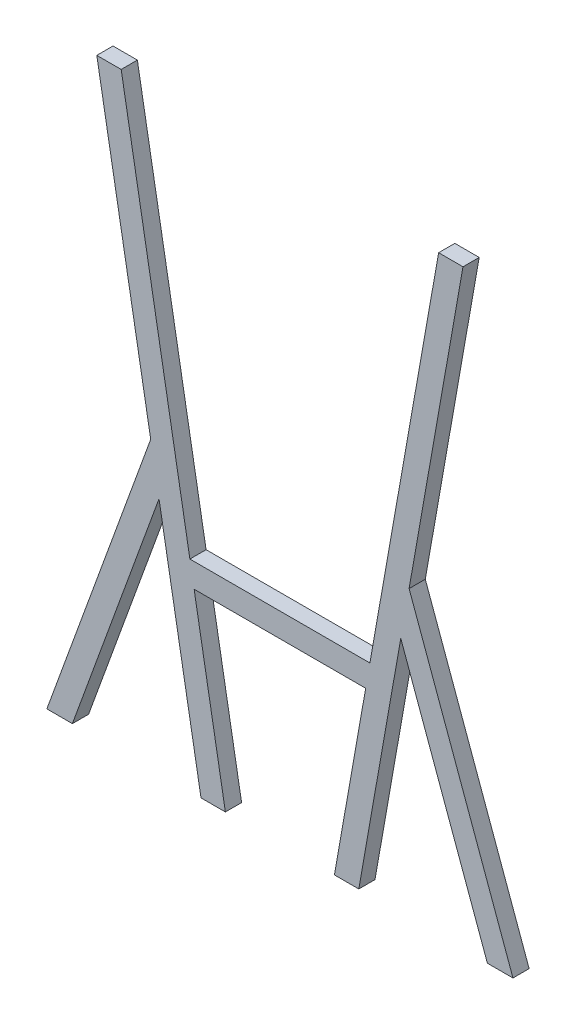
ISO-10303-21;
HEADER;
FILE_DESCRIPTION(('STEP AP214'),'2;1');
FILE_NAME('part.step','',(''),(''),'','','');
FILE_SCHEMA(('AUTOMOTIVE_DESIGN { 1 0 10303 214 1 1 1 1 }'));
ENDSEC;
DATA;
#1=APPLICATION_CONTEXT('core data for automotive mechanical design processes');
#2=APPLICATION_PROTOCOL_DEFINITION('international standard','automotive_design',2000,#1);
#3=PRODUCT_CONTEXT('',#1,'mechanical');
#4=PRODUCT('Part','Part','',(#3));
#5=PRODUCT_RELATED_PRODUCT_CATEGORY('part','',(#4));
#6=PRODUCT_DEFINITION_FORMATION('','',#4);
#7=PRODUCT_DEFINITION_CONTEXT('part definition',#1,'design');
#8=PRODUCT_DEFINITION('design','',#6,#7);
#9=PRODUCT_DEFINITION_SHAPE('','',#8);
#10=(LENGTH_UNIT() NAMED_UNIT(*) SI_UNIT(.MILLI.,.METRE.));
#11=(NAMED_UNIT(*) PLANE_ANGLE_UNIT() SI_UNIT($,.RADIAN.));
#12=(NAMED_UNIT(*) SI_UNIT($,.STERADIAN.) SOLID_ANGLE_UNIT());
#13=UNCERTAINTY_MEASURE_WITH_UNIT(LENGTH_MEASURE(1.E-05),#10,'distance_accuracy_value','');
#14=(GEOMETRIC_REPRESENTATION_CONTEXT(3) GLOBAL_UNCERTAINTY_ASSIGNED_CONTEXT((#13)) GLOBAL_UNIT_ASSIGNED_CONTEXT((#10,
#11,#12)) REPRESENTATION_CONTEXT('',''));
#15=CARTESIAN_POINT('',(0.,0.,0.));
#16=DIRECTION('',(0.,0.,1.));
#17=DIRECTION('',(1.,0.,0.));
#18=AXIS2_PLACEMENT_3D('',#15,#16,#17);
#19=CARTESIAN_POINT('',(262.939063894024,0.,27.));
#20=DIRECTION('',(-0.984807753012208,0.173648177666931,0.));
#21=DIRECTION('',(-0.173648177666931,-0.984807753012208,0.));
#22=AXIS2_PLACEMENT_3D('',#19,#20,#21);
#23=PLANE('',#22);
#24=DIRECTION('',(0.173648177666931,0.984807753012208,0.));
#25=VECTOR('',#24,1.);
#26=CARTESIAN_POINT('',(262.939063894024,0.,27.));
#27=LINE('',#26,#25);
#28=CARTESIAN_POINT('',(346.779804178329,475.484466117671,27.));
#29=VERTEX_POINT('',#28);
#30=CARTESIAN_POINT('',(436.587241560955,984.807753012208,27.));
#31=VERTEX_POINT('',#30);
#32=EDGE_CURVE('E50',#29,#31,#27,.T.);
#33=ORIENTED_EDGE('',*,*,#32,.F.);
#34=DIRECTION('',(0.,0.,1.));
#35=VECTOR('',#34,1.);
#36=CARTESIAN_POINT('',(346.779804178329,475.484466117671,0.));
#37=LINE('',#36,#35);
#38=CARTESIAN_POINT('',(346.779804178329,475.484466117671,0.));
#39=VERTEX_POINT('',#38);
#40=EDGE_CURVE('E187',#39,#29,#37,.T.);
#41=ORIENTED_EDGE('',*,*,#40,.F.);
#42=DIRECTION('',(0.173648177666931,0.984807753012208,0.));
#43=VECTOR('',#42,1.);
#44=CARTESIAN_POINT('',(262.939063894024,0.,0.));
#45=LINE('',#44,#43);
#46=CARTESIAN_POINT('',(436.587241560955,984.807753012208,0.));
#47=VERTEX_POINT('',#46);
#48=EDGE_CURVE('E174',#39,#47,#45,.T.);
#49=ORIENTED_EDGE('',*,*,#48,.T.);
#50=DIRECTION('',(0.,0.,-1.));
#51=VECTOR('',#50,1.);
#52=CARTESIAN_POINT('',(436.587241560955,984.807753012208,27.));
#53=LINE('',#52,#51);
#54=EDGE_CURVE('E307',#31,#47,#53,.T.);
#55=ORIENTED_EDGE('',*,*,#54,.F.);
#56=EDGE_LOOP('',(#33,#41,#49,#55));
#57=FACE_BOUND('',#56,.T.);
#58=ADVANCED_FACE('F35',(#57),#23,.F.);
#59=CARTESIAN_POINT('',(0.,0.,27.));
#60=DIRECTION('',(0.984807753012208,0.173648177666931,0.));
#61=DIRECTION('',(-0.173648177666931,0.984807753012208,0.));
#62=AXIS2_PLACEMENT_3D('',#59,#60,#61);
#63=PLANE('',#62);
#64=DIRECTION('',(0.173648177666931,-0.984807753012208,0.));
#65=VECTOR('',#64,1.);
#66=CARTESIAN_POINT('',(0.,0.,27.));
#67=LINE('',#66,#65);
#68=CARTESIAN_POINT('',(-69.9488860709511,396.699845876693,27.));
#69=VERTEX_POINT('',#68);
#70=CARTESIAN_POINT('',(0.,0.,27.));
#71=VERTEX_POINT('',#70);
#72=EDGE_CURVE('E265',#69,#71,#67,.T.);
#73=ORIENTED_EDGE('',*,*,#72,.F.);
#74=DIRECTION('',(0.,0.,1.));
#75=VECTOR('',#74,1.);
#76=CARTESIAN_POINT('',(-69.9488860709511,396.699845876693,0.));
#77=LINE('',#76,#75);
#78=CARTESIAN_POINT('',(-69.9488860709511,396.699845876693,0.));
#79=VERTEX_POINT('',#78);
#80=EDGE_CURVE('E232',#79,#69,#77,.T.);
#81=ORIENTED_EDGE('',*,*,#80,.F.);
#82=DIRECTION('',(0.173648177666931,-0.984807753012208,0.));
#83=VECTOR('',#82,1.);
#84=CARTESIAN_POINT('',(0.,0.,0.));
#85=LINE('',#84,#83);
#86=CARTESIAN_POINT('',(0.,0.,0.));
#87=VERTEX_POINT('',#86);
#88=EDGE_CURVE('E288',#79,#87,#85,.T.);
#89=ORIENTED_EDGE('',*,*,#88,.T.);
#90=DIRECTION('',(0.,0.,-1.));
#91=VECTOR('',#90,1.);
#92=CARTESIAN_POINT('',(0.,0.,27.));
#93=LINE('',#92,#91);
#94=EDGE_CURVE('E269',#71,#87,#93,.T.);
#95=ORIENTED_EDGE('',*,*,#94,.F.);
#96=EDGE_LOOP('',(#73,#81,#89,#95));
#97=FACE_BOUND('',#96,.T.);
#98=ADVANCED_FACE('F348',(#97),#63,.F.);
#99=CARTESIAN_POINT('',(40.6170644754298,0.,27.));
#100=DIRECTION('',(0.,1.,0.));
#101=DIRECTION('',(-1.,0.,0.));
#102=AXIS2_PLACEMENT_3D('',#99,#100,#101);
#103=PLANE('',#102);
#104=DIRECTION('',(1.,0.,0.));
#105=VECTOR('',#104,1.);
#106=CARTESIAN_POINT('',(40.6170644754298,0.,0.));
#107=LINE('',#106,#105);
#108=CARTESIAN_POINT('',(40.6170644754298,0.,0.));
#109=VERTEX_POINT('',#108);
#110=EDGE_CURVE('E235',#87,#109,#107,.T.);
#111=ORIENTED_EDGE('',*,*,#110,.T.);
#112=DIRECTION('',(0.,0.,-1.));
#113=VECTOR('',#112,1.);
#114=CARTESIAN_POINT('',(40.6170644754298,0.,27.));
#115=LINE('',#114,#113);
#116=CARTESIAN_POINT('',(40.6170644754298,0.,27.));
#117=VERTEX_POINT('',#116);
#118=EDGE_CURVE('E11',#117,#109,#115,.T.);
#119=ORIENTED_EDGE('',*,*,#118,.F.);
#120=DIRECTION('',(1.,0.,0.));
#121=VECTOR('',#120,1.);
#122=CARTESIAN_POINT('',(40.6170644754298,0.,27.));
#123=LINE('',#122,#121);
#124=EDGE_CURVE('E241',#71,#117,#123,.T.);
#125=ORIENTED_EDGE('',*,*,#124,.F.);
#126=ORIENTED_EDGE('',*,*,#94,.T.);
#127=EDGE_LOOP('',(#111,#119,#125,#126));
#128=FACE_BOUND('',#127,.T.);
#129=ADVANCED_FACE('F37',(#128),#103,.F.);
#130=CARTESIAN_POINT('',(40.6170644754298,0.,27.));
#131=DIRECTION('',(-0.984807753012208,-0.173648177666931,0.));
#132=DIRECTION('',(0.173648177666931,-0.984807753012208,0.));
#133=AXIS2_PLACEMENT_3D('',#130,#131,#132);
#134=PLANE('',#133);
#135=DIRECTION('',(-0.173648177666931,0.984807753012208,0.));
#136=VECTOR('',#135,1.);
#137=CARTESIAN_POINT('',(40.6170644754298,0.,0.));
#138=LINE('',#137,#136);
#139=CARTESIAN_POINT('',(-11.4773888246496,295.442325903662,0.));
#140=VERTEX_POINT('',#139);
#141=EDGE_CURVE('E272',#109,#140,#138,.T.);
#142=ORIENTED_EDGE('',*,*,#141,.T.);
#143=DIRECTION('',(0.,0.,-1.));
#144=VECTOR('',#143,1.);
#145=CARTESIAN_POINT('',(-11.4773888246496,295.442325903662,27.));
#146=LINE('',#145,#144);
#147=CARTESIAN_POINT('',(-11.4773888246496,295.442325903662,27.));
#148=VERTEX_POINT('',#147);
#149=EDGE_CURVE('E43',#148,#140,#146,.T.);
#150=ORIENTED_EDGE('',*,*,#149,.F.);
#151=DIRECTION('',(-0.173648177666931,0.984807753012208,0.));
#152=VECTOR('',#151,1.);
#153=CARTESIAN_POINT('',(40.6170644754298,0.,27.));
#154=LINE('',#153,#152);
#155=EDGE_CURVE('E244',#117,#148,#154,.T.);
#156=ORIENTED_EDGE('',*,*,#155,.F.);
#157=ORIENTED_EDGE('',*,*,#118,.T.);
#158=EDGE_LOOP('',(#142,#150,#156,#157));
#159=FACE_BOUND('',#158,.T.);
#160=ADVANCED_FACE('F341',(#159),#134,.F.);
#161=CARTESIAN_POINT('',(-11.4773888246496,295.442325903662,27.));
#162=DIRECTION('',(0.,1.,0.));
#163=DIRECTION('',(0.,0.,1.));
#164=AXIS2_PLACEMENT_3D('',#161,#162,#163);
#165=PLANE('',#164);
#166=DIRECTION('',(1.,0.,0.));
#167=VECTOR('',#166,1.);
#168=CARTESIAN_POINT('',(-11.4773888246496,295.442325903662,0.));
#169=LINE('',#168,#167);
#170=CARTESIAN_POINT('',(274.416452718673,295.442325903662,0.));
#171=VERTEX_POINT('',#170);
#172=EDGE_CURVE('E274',#140,#171,#169,.T.);
#173=ORIENTED_EDGE('',*,*,#172,.T.);
#174=DIRECTION('',(0.,0.,-1.));
#175=VECTOR('',#174,1.);
#176=CARTESIAN_POINT('',(274.416452718673,295.442325903662,27.));
#177=LINE('',#176,#175);
#178=CARTESIAN_POINT('',(274.416452718673,295.442325903662,27.));
#179=VERTEX_POINT('',#178);
#180=EDGE_CURVE('E315',#179,#171,#177,.T.);
#181=ORIENTED_EDGE('',*,*,#180,.F.);
#182=DIRECTION('',(1.,0.,0.));
#183=VECTOR('',#182,1.);
#184=CARTESIAN_POINT('',(-11.4773888246496,295.442325903662,27.));
#185=LINE('',#184,#183);
#186=EDGE_CURVE('E247',#148,#179,#185,.T.);
#187=ORIENTED_EDGE('',*,*,#186,.F.);
#188=ORIENTED_EDGE('',*,*,#149,.T.);
#189=EDGE_LOOP('',(#173,#181,#187,#188));
#190=FACE_BOUND('',#189,.T.);
#191=ADVANCED_FACE('F322',(#190),#165,.F.);
#192=CARTESIAN_POINT('',(222.321999418594,0.,27.));
#193=DIRECTION('',(0.984807753012208,-0.173648177666931,0.));
#194=DIRECTION('',(0.173648177666931,0.984807753012208,0.));
#195=AXIS2_PLACEMENT_3D('',#192,#193,#194);
#196=PLANE('',#195);
#197=DIRECTION('',(-0.173648177666931,-0.984807753012208,0.));
#198=VECTOR('',#197,1.);
#199=CARTESIAN_POINT('',(222.321999418594,0.,0.));
#200=LINE('',#199,#198);
#201=CARTESIAN_POINT('',(222.321999418594,0.,0.));
#202=VERTEX_POINT('',#201);
#203=EDGE_CURVE('E276',#171,#202,#200,.T.);
#204=ORIENTED_EDGE('',*,*,#203,.T.);
#205=DIRECTION('',(0.,0.,-1.));
#206=VECTOR('',#205,1.);
#207=CARTESIAN_POINT('',(222.321999418594,0.,27.));
#208=LINE('',#207,#206);
#209=CARTESIAN_POINT('',(222.321999418594,0.,27.));
#210=VERTEX_POINT('',#209);
#211=EDGE_CURVE('E312',#210,#202,#208,.T.);
#212=ORIENTED_EDGE('',*,*,#211,.F.);
#213=DIRECTION('',(-0.173648177666931,-0.984807753012208,0.));
#214=VECTOR('',#213,1.);
#215=CARTESIAN_POINT('',(222.321999418594,0.,27.));
#216=LINE('',#215,#214);
#217=EDGE_CURVE('E249',#179,#210,#216,.T.);
#218=ORIENTED_EDGE('',*,*,#217,.F.);
#219=ORIENTED_EDGE('',*,*,#180,.T.);
#220=EDGE_LOOP('',(#204,#212,#218,#219));
#221=FACE_BOUND('',#220,.T.);
#222=ADVANCED_FACE('F330',(#221),#196,.F.);
#223=CARTESIAN_POINT('',(222.321999418594,0.,27.));
#224=DIRECTION('',(0.,1.,0.));
#225=DIRECTION('',(0.,0.,1.));
#226=AXIS2_PLACEMENT_3D('',#223,#224,#225);
#227=PLANE('',#226);
#228=DIRECTION('',(1.,0.,0.));
#229=VECTOR('',#228,1.);
#230=CARTESIAN_POINT('',(222.321999418594,0.,0.));
#231=LINE('',#230,#229);
#232=CARTESIAN_POINT('',(262.939063894024,0.,0.));
#233=VERTEX_POINT('',#232);
#234=EDGE_CURVE('E185',#202,#233,#231,.T.);
#235=ORIENTED_EDGE('',*,*,#234,.T.);
#236=DIRECTION('',(0.,0.,-1.));
#237=VECTOR('',#236,1.);
#238=CARTESIAN_POINT('',(262.939063894024,0.,27.));
#239=LINE('',#238,#237);
#240=CARTESIAN_POINT('',(262.939063894024,0.,27.));
#241=VERTEX_POINT('',#240);
#242=EDGE_CURVE('E309',#241,#233,#239,.T.);
#243=ORIENTED_EDGE('',*,*,#242,.F.);
#244=DIRECTION('',(1.,0.,0.));
#245=VECTOR('',#244,1.);
#246=CARTESIAN_POINT('',(222.321999418594,0.,27.));
#247=LINE('',#246,#245);
#248=EDGE_CURVE('E251',#210,#241,#247,.T.);
#249=ORIENTED_EDGE('',*,*,#248,.F.);
#250=ORIENTED_EDGE('',*,*,#211,.T.);
#251=EDGE_LOOP('',(#235,#243,#249,#250));
#252=FACE_BOUND('',#251,.T.);
#253=ADVANCED_FACE('F334',(#252),#227,.F.);
#254=CARTESIAN_POINT('',(332.887949964975,396.699845876693,0.));
#255=VERTEX_POINT('',#254);
#256=EDGE_CURVE('E184',#233,#255,#45,.T.);
#257=ORIENTED_EDGE('',*,*,#256,.T.);
#258=DIRECTION('',(0.,0.,1.));
#259=VECTOR('',#258,1.);
#260=CARTESIAN_POINT('',(332.887949964975,396.699845876693,0.));
#261=LINE('',#260,#259);
#262=CARTESIAN_POINT('',(332.887949964975,396.699845876693,27.));
#263=VERTEX_POINT('',#262);
#264=EDGE_CURVE('E58',#255,#263,#261,.T.);
#265=ORIENTED_EDGE('',*,*,#264,.T.);
#266=EDGE_CURVE('E253',#241,#263,#27,.T.);
#267=ORIENTED_EDGE('',*,*,#266,.F.);
#268=ORIENTED_EDGE('',*,*,#242,.T.);
#269=EDGE_LOOP('',(#257,#265,#267,#268));
#270=FACE_BOUND('',#269,.T.);
#271=ADVANCED_FACE('F402',(#270),#23,.F.);
#272=CARTESIAN_POINT('',(436.587241560955,984.807753012208,27.));
#273=DIRECTION('',(0.,-1.,0.));
#274=DIRECTION('',(0.,0.,-1.));
#275=AXIS2_PLACEMENT_3D('',#272,#273,#274);
#276=PLANE('',#275);
#277=DIRECTION('',(-1.,0.,0.));
#278=VECTOR('',#277,1.);
#279=CARTESIAN_POINT('',(436.587241560955,984.807753012208,0.));
#280=LINE('',#279,#278);
#281=CARTESIAN_POINT('',(395.970177085525,984.807753012208,0.));
#282=VERTEX_POINT('',#281);
#283=EDGE_CURVE('E182',#47,#282,#280,.T.);
#284=ORIENTED_EDGE('',*,*,#283,.T.);
#285=DIRECTION('',(0.,0.,-1.));
#286=VECTOR('',#285,1.);
#287=CARTESIAN_POINT('',(395.970177085525,984.807753012208,27.));
#288=LINE('',#287,#286);
#289=CARTESIAN_POINT('',(395.970177085525,984.807753012208,27.));
#290=VERTEX_POINT('',#289);
#291=EDGE_CURVE('E304',#290,#282,#288,.T.);
#292=ORIENTED_EDGE('',*,*,#291,.F.);
#293=DIRECTION('',(-1.,0.,0.));
#294=VECTOR('',#293,1.);
#295=CARTESIAN_POINT('',(436.587241560955,984.807753012208,27.));
#296=LINE('',#295,#294);
#297=EDGE_CURVE('E255',#31,#290,#296,.T.);
#298=ORIENTED_EDGE('',*,*,#297,.F.);
#299=ORIENTED_EDGE('',*,*,#54,.T.);
#300=EDGE_LOOP('',(#284,#292,#298,#299));
#301=FACE_BOUND('',#300,.T.);
#302=ADVANCED_FACE('F386',(#301),#276,.F.);
#303=CARTESIAN_POINT('',(281.469531947012,335.442325903662,27.));
#304=DIRECTION('',(0.984807753012208,-0.173648177666931,0.));
#305=DIRECTION('',(0.173648177666931,0.984807753012208,0.));
#306=AXIS2_PLACEMENT_3D('',#303,#304,#305);
#307=PLANE('',#306);
#308=DIRECTION('',(-0.173648177666931,-0.984807753012208,0.));
#309=VECTOR('',#308,1.);
#310=CARTESIAN_POINT('',(281.469531947012,335.442325903662,0.));
#311=LINE('',#310,#309);
#312=CARTESIAN_POINT('',(281.469531947012,335.442325903662,0.));
#313=VERTEX_POINT('',#312);
#314=EDGE_CURVE('E280',#282,#313,#311,.T.);
#315=ORIENTED_EDGE('',*,*,#314,.T.);
#316=DIRECTION('',(0.,0.,-1.));
#317=VECTOR('',#316,1.);
#318=CARTESIAN_POINT('',(281.469531947012,335.442325903662,27.));
#319=LINE('',#318,#317);
#320=CARTESIAN_POINT('',(281.469531947012,335.442325903662,27.));
#321=VERTEX_POINT('',#320);
#322=EDGE_CURVE('E301',#321,#313,#319,.T.);
#323=ORIENTED_EDGE('',*,*,#322,.F.);
#324=DIRECTION('',(-0.173648177666931,-0.984807753012208,0.));
#325=VECTOR('',#324,1.);
#326=CARTESIAN_POINT('',(281.469531947012,335.442325903662,27.));
#327=LINE('',#326,#325);
#328=EDGE_CURVE('E257',#290,#321,#327,.T.);
#329=ORIENTED_EDGE('',*,*,#328,.F.);
#330=ORIENTED_EDGE('',*,*,#291,.T.);
#331=EDGE_LOOP('',(#315,#323,#329,#330));
#332=FACE_BOUND('',#331,.T.);
#333=ADVANCED_FACE('F382',(#332),#307,.F.);
#334=CARTESIAN_POINT('',(281.469531947012,335.442325903662,27.));
#335=DIRECTION('',(0.,-1.,0.));
#336=DIRECTION('',(1.,0.,0.));
#337=AXIS2_PLACEMENT_3D('',#334,#335,#336);
#338=PLANE('',#337);
#339=DIRECTION('',(-1.,0.,0.));
#340=VECTOR('',#339,1.);
#341=CARTESIAN_POINT('',(281.469531947012,335.442325903662,0.));
#342=LINE('',#341,#340);
#343=CARTESIAN_POINT('',(-18.5304680529882,335.442325903662,0.));
#344=VERTEX_POINT('',#343);
#345=EDGE_CURVE('E282',#313,#344,#342,.T.);
#346=ORIENTED_EDGE('',*,*,#345,.T.);
#347=DIRECTION('',(0.,0.,-1.));
#348=VECTOR('',#347,1.);
#349=CARTESIAN_POINT('',(-18.5304680529882,335.442325903662,27.));
#350=LINE('',#349,#348);
#351=CARTESIAN_POINT('',(-18.5304680529882,335.442325903662,27.));
#352=VERTEX_POINT('',#351);
#353=EDGE_CURVE('E298',#352,#344,#350,.T.);
#354=ORIENTED_EDGE('',*,*,#353,.F.);
#355=DIRECTION('',(-1.,0.,0.));
#356=VECTOR('',#355,1.);
#357=CARTESIAN_POINT('',(281.469531947012,335.442325903662,27.));
#358=LINE('',#357,#356);
#359=EDGE_CURVE('E259',#321,#352,#358,.T.);
#360=ORIENTED_EDGE('',*,*,#359,.F.);
#361=ORIENTED_EDGE('',*,*,#322,.T.);
#362=EDGE_LOOP('',(#346,#354,#360,#361));
#363=FACE_BOUND('',#362,.T.);
#364=ADVANCED_FACE('F378',(#363),#338,.F.);
#365=CARTESIAN_POINT('',(-18.5304680529882,335.442325903662,27.));
#366=DIRECTION('',(-0.984807753012208,-0.173648177666931,0.));
#367=DIRECTION('',(0.173648177666931,-0.984807753012208,0.));
#368=AXIS2_PLACEMENT_3D('',#365,#366,#367);
#369=PLANE('',#368);
#370=DIRECTION('',(-0.173648177666931,0.984807753012208,0.));
#371=VECTOR('',#370,1.);
#372=CARTESIAN_POINT('',(-18.5304680529882,335.442325903662,0.));
#373=LINE('',#372,#371);
#374=CARTESIAN_POINT('',(-133.031113191501,984.807753012208,0.));
#375=VERTEX_POINT('',#374);
#376=EDGE_CURVE('E284',#344,#375,#373,.T.);
#377=ORIENTED_EDGE('',*,*,#376,.T.);
#378=DIRECTION('',(0.,0.,-1.));
#379=VECTOR('',#378,1.);
#380=CARTESIAN_POINT('',(-133.031113191501,984.807753012208,27.));
#381=LINE('',#380,#379);
#382=CARTESIAN_POINT('',(-133.031113191501,984.807753012208,27.));
#383=VERTEX_POINT('',#382);
#384=EDGE_CURVE('E295',#383,#375,#381,.T.);
#385=ORIENTED_EDGE('',*,*,#384,.F.);
#386=DIRECTION('',(-0.173648177666931,0.984807753012208,0.));
#387=VECTOR('',#386,1.);
#388=CARTESIAN_POINT('',(-18.5304680529882,335.442325903662,27.));
#389=LINE('',#388,#387);
#390=EDGE_CURVE('E261',#352,#383,#389,.T.);
#391=ORIENTED_EDGE('',*,*,#390,.F.);
#392=ORIENTED_EDGE('',*,*,#353,.T.);
#393=EDGE_LOOP('',(#377,#385,#391,#392));
#394=FACE_BOUND('',#393,.T.);
#395=ADVANCED_FACE('F374',(#394),#369,.F.);
#396=CARTESIAN_POINT('',(-173.648177666931,984.807753012208,27.));
#397=DIRECTION('',(0.,-1.,0.));
#398=DIRECTION('',(0.,0.,-1.));
#399=AXIS2_PLACEMENT_3D('',#396,#397,#398);
#400=PLANE('',#399);
#401=DIRECTION('',(-1.,0.,0.));
#402=VECTOR('',#401,1.);
#403=CARTESIAN_POINT('',(-173.648177666931,984.807753012208,0.));
#404=LINE('',#403,#402);
#405=CARTESIAN_POINT('',(-173.648177666931,984.807753012208,0.));
#406=VERTEX_POINT('',#405);
#407=EDGE_CURVE('E286',#375,#406,#404,.T.);
#408=ORIENTED_EDGE('',*,*,#407,.T.);
#409=DIRECTION('',(0.,0.,-1.));
#410=VECTOR('',#409,1.);
#411=CARTESIAN_POINT('',(-173.648177666931,984.807753012208,27.));
#412=LINE('',#411,#410);
#413=CARTESIAN_POINT('',(-173.648177666931,984.807753012208,27.));
#414=VERTEX_POINT('',#413);
#415=EDGE_CURVE('E292',#414,#406,#412,.T.);
#416=ORIENTED_EDGE('',*,*,#415,.F.);
#417=DIRECTION('',(-1.,0.,0.));
#418=VECTOR('',#417,1.);
#419=CARTESIAN_POINT('',(-173.648177666931,984.807753012208,27.));
#420=LINE('',#419,#418);
#421=EDGE_CURVE('E263',#383,#414,#420,.T.);
#422=ORIENTED_EDGE('',*,*,#421,.F.);
#423=ORIENTED_EDGE('',*,*,#384,.T.);
#424=EDGE_LOOP('',(#408,#416,#422,#423));
#425=FACE_BOUND('',#424,.T.);
#426=ADVANCED_FACE('F369',(#425),#400,.F.);
#427=CARTESIAN_POINT('',(-83.8407402843058,475.484466117671,0.));
#428=VERTEX_POINT('',#427);
#429=EDGE_CURVE('E245',#406,#428,#85,.T.);
#430=ORIENTED_EDGE('',*,*,#429,.T.);
#431=DIRECTION('',(0.,0.,1.));
#432=VECTOR('',#431,1.);
#433=CARTESIAN_POINT('',(-83.8407402843057,475.484466117671,0.));
#434=LINE('',#433,#432);
#435=CARTESIAN_POINT('',(-83.8407402843058,475.484466117671,27.));
#436=VERTEX_POINT('',#435);
#437=EDGE_CURVE('E224',#428,#436,#434,.T.);
#438=ORIENTED_EDGE('',*,*,#437,.T.);
#439=EDGE_CURVE('E266',#414,#436,#67,.T.);
#440=ORIENTED_EDGE('',*,*,#439,.F.);
#441=ORIENTED_EDGE('',*,*,#415,.T.);
#442=EDGE_LOOP('',(#430,#438,#440,#441));
#443=FACE_BOUND('',#442,.T.);
#444=ADVANCED_FACE('F363',(#443),#63,.F.);
#445=CARTESIAN_POINT('',(0.,0.,27.));
#446=DIRECTION('',(0.,0.,-1.));
#447=DIRECTION('',(-1.,0.,0.));
#448=AXIS2_PLACEMENT_3D('',#445,#446,#447);
#449=PLANE('',#448);
#450=ORIENTED_EDGE('',*,*,#124,.T.);
#451=ORIENTED_EDGE('',*,*,#155,.T.);
#452=ORIENTED_EDGE('',*,*,#186,.T.);
#453=ORIENTED_EDGE('',*,*,#217,.T.);
#454=ORIENTED_EDGE('',*,*,#248,.T.);
#455=ORIENTED_EDGE('',*,*,#266,.T.);
#456=DIRECTION('',(0.342020143325662,-0.939692620785911,0.));
#457=VECTOR('',#456,1.);
#458=CARTESIAN_POINT('',(332.887949964975,396.699845876693,27.));
#459=LINE('',#458,#457);
#460=CARTESIAN_POINT('',(477.274885802078,0.,27.));
#461=VERTEX_POINT('',#460);
#462=EDGE_CURVE('E201',#263,#461,#459,.T.);
#463=ORIENTED_EDGE('',*,*,#462,.T.);
#464=DIRECTION('',(1.,0.,0.));
#465=VECTOR('',#464,1.);
#466=CARTESIAN_POINT('',(477.274885802078,0.,27.));
#467=LINE('',#466,#465);
#468=CARTESIAN_POINT('',(519.841996701115,0.,27.));
#469=VERTEX_POINT('',#468);
#470=EDGE_CURVE('E196',#461,#469,#467,.T.);
#471=ORIENTED_EDGE('',*,*,#470,.T.);
#472=DIRECTION('',(-0.342020143325662,0.939692620785911,0.));
#473=VECTOR('',#472,1.);
#474=CARTESIAN_POINT('',(519.841996701115,0.,27.));
#475=LINE('',#474,#473);
#476=EDGE_CURVE('E205',#469,#29,#475,.T.);
#477=ORIENTED_EDGE('',*,*,#476,.T.);
#478=ORIENTED_EDGE('',*,*,#32,.T.);
#479=ORIENTED_EDGE('',*,*,#297,.T.);
#480=ORIENTED_EDGE('',*,*,#328,.T.);
#481=ORIENTED_EDGE('',*,*,#359,.T.);
#482=ORIENTED_EDGE('',*,*,#390,.T.);
#483=ORIENTED_EDGE('',*,*,#421,.T.);
#484=ORIENTED_EDGE('',*,*,#439,.T.);
#485=DIRECTION('',(-0.342020143325662,-0.939692620785911,0.));
#486=VECTOR('',#485,1.);
#487=CARTESIAN_POINT('',(-256.902932807091,0.,27.));
#488=LINE('',#487,#486);
#489=CARTESIAN_POINT('',(-256.902932807091,0.,27.));
#490=VERTEX_POINT('',#489);
#491=EDGE_CURVE('E210',#436,#490,#488,.T.);
#492=ORIENTED_EDGE('',*,*,#491,.T.);
#493=DIRECTION('',(1.,0.,0.));
#494=VECTOR('',#493,1.);
#495=CARTESIAN_POINT('',(-214.335821908054,0.,27.));
#496=LINE('',#495,#494);
#497=CARTESIAN_POINT('',(-214.335821908054,0.,27.));
#498=VERTEX_POINT('',#497);
#499=EDGE_CURVE('E227',#490,#498,#496,.T.);
#500=ORIENTED_EDGE('',*,*,#499,.T.);
#501=DIRECTION('',(0.342020143325662,0.939692620785911,0.));
#502=VECTOR('',#501,1.);
#503=CARTESIAN_POINT('',(-69.9488860709511,396.699845876693,27.));
#504=LINE('',#503,#502);
#505=EDGE_CURVE('E218',#498,#69,#504,.T.);
#506=ORIENTED_EDGE('',*,*,#505,.T.);
#507=ORIENTED_EDGE('',*,*,#72,.T.);
#508=EDGE_LOOP('',(#450,#451,#452,#453,#454,#455,#463,#471,#477,#478,#479,#480,#481,#482,#483,
#484,#492,#500,#506,#507));
#509=FACE_BOUND('',#508,.T.);
#510=ADVANCED_FACE('F337',(#509),#449,.F.);
#511=CARTESIAN_POINT('',(0.,0.,0.));
#512=DIRECTION('',(0.,0.,-1.));
#513=DIRECTION('',(-1.,0.,0.));
#514=AXIS2_PLACEMENT_3D('',#511,#512,#513);
#515=PLANE('',#514);
#516=ORIENTED_EDGE('',*,*,#110,.F.);
#517=ORIENTED_EDGE('',*,*,#88,.F.);
#518=DIRECTION('',(0.342020143325662,0.939692620785911,0.));
#519=VECTOR('',#518,1.);
#520=CARTESIAN_POINT('',(-69.9488860709511,396.699845876693,0.));
#521=LINE('',#520,#519);
#522=CARTESIAN_POINT('',(-214.335821908054,0.,0.));
#523=VERTEX_POINT('',#522);
#524=EDGE_CURVE('E221',#523,#79,#521,.T.);
#525=ORIENTED_EDGE('',*,*,#524,.F.);
#526=DIRECTION('',(1.,0.,0.));
#527=VECTOR('',#526,1.);
#528=CARTESIAN_POINT('',(-214.335821908054,0.,0.));
#529=LINE('',#528,#527);
#530=CARTESIAN_POINT('',(-256.902932807091,0.,0.));
#531=VERTEX_POINT('',#530);
#532=EDGE_CURVE('E217',#531,#523,#529,.T.);
#533=ORIENTED_EDGE('',*,*,#532,.F.);
#534=DIRECTION('',(-0.342020143325662,-0.939692620785911,0.));
#535=VECTOR('',#534,1.);
#536=CARTESIAN_POINT('',(-256.902932807091,0.,0.));
#537=LINE('',#536,#535);
#538=EDGE_CURVE('E214',#428,#531,#537,.T.);
#539=ORIENTED_EDGE('',*,*,#538,.F.);
#540=ORIENTED_EDGE('',*,*,#429,.F.);
#541=ORIENTED_EDGE('',*,*,#407,.F.);
#542=ORIENTED_EDGE('',*,*,#376,.F.);
#543=ORIENTED_EDGE('',*,*,#345,.F.);
#544=ORIENTED_EDGE('',*,*,#314,.F.);
#545=ORIENTED_EDGE('',*,*,#283,.F.);
#546=ORIENTED_EDGE('',*,*,#48,.F.);
#547=DIRECTION('',(-0.342020143325662,0.939692620785911,0.));
#548=VECTOR('',#547,1.);
#549=CARTESIAN_POINT('',(519.841996701115,0.,0.));
#550=LINE('',#549,#548);
#551=CARTESIAN_POINT('',(519.841996701115,0.,0.));
#552=VERTEX_POINT('',#551);
#553=EDGE_CURVE('E179',#552,#39,#550,.T.);
#554=ORIENTED_EDGE('',*,*,#553,.F.);
#555=DIRECTION('',(1.,0.,0.));
#556=VECTOR('',#555,1.);
#557=CARTESIAN_POINT('',(477.274885802078,0.,0.));
#558=LINE('',#557,#556);
#559=CARTESIAN_POINT('',(477.274885802078,0.,0.));
#560=VERTEX_POINT('',#559);
#561=EDGE_CURVE('E191',#560,#552,#558,.T.);
#562=ORIENTED_EDGE('',*,*,#561,.F.);
#563=DIRECTION('',(0.342020143325662,-0.939692620785911,0.));
#564=VECTOR('',#563,1.);
#565=CARTESIAN_POINT('',(332.887949964975,396.699845876693,0.));
#566=LINE('',#565,#564);
#567=EDGE_CURVE('E195',#255,#560,#566,.T.);
#568=ORIENTED_EDGE('',*,*,#567,.F.);
#569=ORIENTED_EDGE('',*,*,#256,.F.);
#570=ORIENTED_EDGE('',*,*,#234,.F.);
#571=ORIENTED_EDGE('',*,*,#203,.F.);
#572=ORIENTED_EDGE('',*,*,#172,.F.);
#573=ORIENTED_EDGE('',*,*,#141,.F.);
#574=EDGE_LOOP('',(#516,#517,#525,#533,#539,#540,#541,#542,#543,#544,#545,#546,#554,#562,#568,
#569,#570,#571,#572,#573));
#575=FACE_BOUND('',#574,.T.);
#576=ADVANCED_FACE('F176',(#575),#515,.T.);
#577=CARTESIAN_POINT('',(-69.9488860709511,396.699845876693,0.));
#578=DIRECTION('',(0.939692620785911,-0.342020143325662,0.));
#579=DIRECTION('',(0.342020143325662,0.939692620785911,0.));
#580=AXIS2_PLACEMENT_3D('',#577,#578,#579);
#581=PLANE('',#580);
#582=ORIENTED_EDGE('',*,*,#505,.F.);
#583=DIRECTION('',(0.,0.,1.));
#584=VECTOR('',#583,1.);
#585=CARTESIAN_POINT('',(-214.335821908054,0.,0.));
#586=LINE('',#585,#584);
#587=EDGE_CURVE('E236',#523,#498,#586,.T.);
#588=ORIENTED_EDGE('',*,*,#587,.F.);
#589=ORIENTED_EDGE('',*,*,#524,.T.);
#590=ORIENTED_EDGE('',*,*,#80,.T.);
#591=EDGE_LOOP('',(#582,#588,#589,#590));
#592=FACE_BOUND('',#591,.T.);
#593=ADVANCED_FACE('F351',(#592),#581,.T.);
#594=CARTESIAN_POINT('',(-214.335821908054,0.,0.));
#595=DIRECTION('',(0.,-1.,0.));
#596=DIRECTION('',(1.,0.,0.));
#597=AXIS2_PLACEMENT_3D('',#594,#595,#596);
#598=PLANE('',#597);
#599=ORIENTED_EDGE('',*,*,#499,.F.);
#600=DIRECTION('',(0.,0.,1.));
#601=VECTOR('',#600,1.);
#602=CARTESIAN_POINT('',(-256.902932807091,0.,0.));
#603=LINE('',#602,#601);
#604=EDGE_CURVE('E238',#531,#490,#603,.T.);
#605=ORIENTED_EDGE('',*,*,#604,.F.);
#606=ORIENTED_EDGE('',*,*,#532,.T.);
#607=ORIENTED_EDGE('',*,*,#587,.T.);
#608=EDGE_LOOP('',(#599,#605,#606,#607));
#609=FACE_BOUND('',#608,.T.);
#610=ADVANCED_FACE('F354',(#609),#598,.T.);
#611=CARTESIAN_POINT('',(-256.902932807091,0.,0.));
#612=DIRECTION('',(-0.939692620785911,0.342020143325662,0.));
#613=DIRECTION('',(-0.342020143325662,-0.939692620785911,0.));
#614=AXIS2_PLACEMENT_3D('',#611,#612,#613);
#615=PLANE('',#614);
#616=ORIENTED_EDGE('',*,*,#491,.F.);
#617=ORIENTED_EDGE('',*,*,#437,.F.);
#618=ORIENTED_EDGE('',*,*,#538,.T.);
#619=ORIENTED_EDGE('',*,*,#604,.T.);
#620=EDGE_LOOP('',(#616,#617,#618,#619));
#621=FACE_BOUND('',#620,.T.);
#622=ADVANCED_FACE('F360',(#621),#615,.T.);
#623=CARTESIAN_POINT('',(519.841996701115,0.,0.));
#624=DIRECTION('',(0.939692620785911,0.342020143325662,0.));
#625=DIRECTION('',(-0.342020143325662,0.939692620785911,0.));
#626=AXIS2_PLACEMENT_3D('',#623,#624,#625);
#627=PLANE('',#626);
#628=ORIENTED_EDGE('',*,*,#476,.F.);
#629=DIRECTION('',(0.,0.,1.));
#630=VECTOR('',#629,1.);
#631=CARTESIAN_POINT('',(519.841996701115,0.,0.));
#632=LINE('',#631,#630);
#633=EDGE_CURVE('E194',#552,#469,#632,.T.);
#634=ORIENTED_EDGE('',*,*,#633,.F.);
#635=ORIENTED_EDGE('',*,*,#553,.T.);
#636=ORIENTED_EDGE('',*,*,#40,.T.);
#637=EDGE_LOOP('',(#628,#634,#635,#636));
#638=FACE_BOUND('',#637,.T.);
#639=ADVANCED_FACE('F193',(#638),#627,.T.);
#640=CARTESIAN_POINT('',(477.274885802078,0.,0.));
#641=DIRECTION('',(0.,-1.,0.));
#642=DIRECTION('',(1.,0.,0.));
#643=AXIS2_PLACEMENT_3D('',#640,#641,#642);
#644=PLANE('',#643);
#645=ORIENTED_EDGE('',*,*,#470,.F.);
#646=DIRECTION('',(0.,0.,1.));
#647=VECTOR('',#646,1.);
#648=CARTESIAN_POINT('',(477.274885802078,0.,0.));
#649=LINE('',#648,#647);
#650=EDGE_CURVE('E211',#560,#461,#649,.T.);
#651=ORIENTED_EDGE('',*,*,#650,.F.);
#652=ORIENTED_EDGE('',*,*,#561,.T.);
#653=ORIENTED_EDGE('',*,*,#633,.T.);
#654=EDGE_LOOP('',(#645,#651,#652,#653));
#655=FACE_BOUND('',#654,.T.);
#656=ADVANCED_FACE('F389',(#655),#644,.T.);
#657=CARTESIAN_POINT('',(332.887949964975,396.699845876693,0.));
#658=DIRECTION('',(-0.939692620785911,-0.342020143325662,0.));
#659=DIRECTION('',(0.342020143325662,-0.939692620785911,0.));
#660=AXIS2_PLACEMENT_3D('',#657,#658,#659);
#661=PLANE('',#660);
#662=ORIENTED_EDGE('',*,*,#462,.F.);
#663=ORIENTED_EDGE('',*,*,#264,.F.);
#664=ORIENTED_EDGE('',*,*,#567,.T.);
#665=ORIENTED_EDGE('',*,*,#650,.T.);
#666=EDGE_LOOP('',(#662,#663,#664,#665));
#667=FACE_BOUND('',#666,.T.);
#668=ADVANCED_FACE('F392',(#667),#661,.T.);
#669=CLOSED_SHELL('',(#58,#98,#129,#160,#191,#222,#253,#271,#302,#333,#364,#395,#426,#444,#510,
#576,#593,#610,#622,#639,#656,#668));
#670=MANIFOLD_SOLID_BREP('B2',#669);
#671=ADVANCED_BREP_SHAPE_REPRESENTATION('',(#18,#670),#14);
#672=SHAPE_DEFINITION_REPRESENTATION(#9,#671);
ENDSEC;
END-ISO-10303-21;
